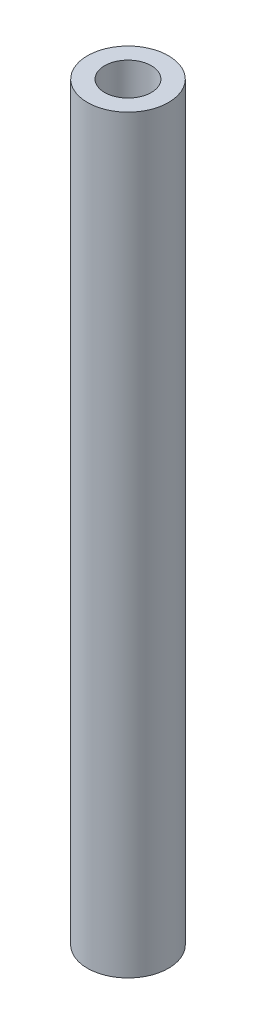
ISO-10303-21;
HEADER;
FILE_DESCRIPTION(('STEP AP214'),'2;1');
FILE_NAME('part.step','',(''),(''),'','','');
FILE_SCHEMA(('AUTOMOTIVE_DESIGN { 1 0 10303 214 1 1 1 1 }'));
ENDSEC;
DATA;
#1=APPLICATION_CONTEXT('core data for automotive mechanical design processes');
#2=APPLICATION_PROTOCOL_DEFINITION('international standard','automotive_design',2000,#1);
#3=PRODUCT_CONTEXT('',#1,'mechanical');
#4=PRODUCT('Part','Part','',(#3));
#5=PRODUCT_RELATED_PRODUCT_CATEGORY('part','',(#4));
#6=PRODUCT_DEFINITION_FORMATION('','',#4);
#7=PRODUCT_DEFINITION_CONTEXT('part definition',#1,'design');
#8=PRODUCT_DEFINITION('design','',#6,#7);
#9=PRODUCT_DEFINITION_SHAPE('','',#8);
#10=(LENGTH_UNIT() NAMED_UNIT(*) SI_UNIT(.MILLI.,.METRE.));
#11=(NAMED_UNIT(*) PLANE_ANGLE_UNIT() SI_UNIT($,.RADIAN.));
#12=(NAMED_UNIT(*) SI_UNIT($,.STERADIAN.) SOLID_ANGLE_UNIT());
#13=UNCERTAINTY_MEASURE_WITH_UNIT(LENGTH_MEASURE(1.E-05),#10,'distance_accuracy_value','');
#14=(GEOMETRIC_REPRESENTATION_CONTEXT(3) GLOBAL_UNCERTAINTY_ASSIGNED_CONTEXT((#13)) GLOBAL_UNIT_ASSIGNED_CONTEXT((#10,
#11,#12)) REPRESENTATION_CONTEXT('',''));
#15=CARTESIAN_POINT('',(0.,0.,0.));
#16=DIRECTION('',(0.,0.,1.));
#17=DIRECTION('',(1.,0.,0.));
#18=AXIS2_PLACEMENT_3D('',#15,#16,#17);
#19=CARTESIAN_POINT('',(0.,37.,0.));
#20=DIRECTION('',(0.,-1.,0.));
#21=DIRECTION('',(0.,0.,-1.));
#22=AXIS2_PLACEMENT_3D('',#19,#20,#21);
#23=CYLINDRICAL_SURFACE('',#22,2.);
#24=CARTESIAN_POINT('',(0.,37.,0.));
#25=DIRECTION('',(0.,1.,0.));
#26=DIRECTION('',(0.,0.,1.));
#27=AXIS2_PLACEMENT_3D('',#24,#25,#26);
#28=CIRCLE('',#27,2.);
#29=CARTESIAN_POINT('',(0.,37.,2.));
#30=VERTEX_POINT('',#29);
#31=EDGE_CURVE('E12',#30,#30,#28,.T.);
#32=ORIENTED_EDGE('',*,*,#31,.F.);
#33=EDGE_LOOP('',(#32));
#34=FACE_BOUND('',#33,.T.);
#35=CARTESIAN_POINT('',(0.,0.,0.));
#36=DIRECTION('',(0.,1.,0.));
#37=DIRECTION('',(0.,0.,1.));
#38=AXIS2_PLACEMENT_3D('',#35,#36,#37);
#39=CIRCLE('',#38,2.);
#40=CARTESIAN_POINT('',(0.,0.,2.));
#41=VERTEX_POINT('',#40);
#42=EDGE_CURVE('E49',#41,#41,#39,.T.);
#43=ORIENTED_EDGE('',*,*,#42,.T.);
#44=EDGE_LOOP('',(#43));
#45=FACE_BOUND('',#44,.T.);
#46=ADVANCED_FACE('F46',(#34,#45),#23,.T.);
#47=CARTESIAN_POINT('',(0.,37.,0.));
#48=DIRECTION('',(0.,1.,0.));
#49=DIRECTION('',(0.,0.,1.));
#50=AXIS2_PLACEMENT_3D('',#47,#48,#49);
#51=PLANE('',#50);
#52=CARTESIAN_POINT('',(0.,37.,0.));
#53=DIRECTION('',(0.,-1.,0.));
#54=DIRECTION('',(0.,0.,-1.));
#55=AXIS2_PLACEMENT_3D('',#52,#53,#54);
#56=CIRCLE('',#55,1.15);
#57=CARTESIAN_POINT('',(0.,37.,-1.15));
#58=VERTEX_POINT('',#57);
#59=EDGE_CURVE('E56',#58,#58,#56,.T.);
#60=ORIENTED_EDGE('',*,*,#59,.T.);
#61=EDGE_LOOP('',(#60));
#62=FACE_BOUND('',#61,.T.);
#63=ORIENTED_EDGE('',*,*,#31,.T.);
#64=EDGE_LOOP('',(#63));
#65=FACE_BOUND('',#64,.T.);
#66=ADVANCED_FACE('F64',(#62,#65),#51,.T.);
#67=CARTESIAN_POINT('',(0.,0.,0.));
#68=DIRECTION('',(0.,1.,0.));
#69=DIRECTION('',(0.,0.,1.));
#70=AXIS2_PLACEMENT_3D('',#67,#68,#69);
#71=PLANE('',#70);
#72=CARTESIAN_POINT('',(0.,0.,0.));
#73=DIRECTION('',(0.,-1.,0.));
#74=DIRECTION('',(0.,0.,-1.));
#75=AXIS2_PLACEMENT_3D('',#72,#73,#74);
#76=CIRCLE('',#75,1.15);
#77=CARTESIAN_POINT('',(0.,0.,-1.15));
#78=VERTEX_POINT('',#77);
#79=EDGE_CURVE('E58',#78,#78,#76,.T.);
#80=ORIENTED_EDGE('',*,*,#79,.F.);
#81=EDGE_LOOP('',(#80));
#82=FACE_BOUND('',#81,.T.);
#83=ORIENTED_EDGE('',*,*,#42,.F.);
#84=EDGE_LOOP('',(#83));
#85=FACE_BOUND('',#84,.T.);
#86=ADVANCED_FACE('F69',(#82,#85),#71,.F.);
#87=CARTESIAN_POINT('',(0.,37.,0.));
#88=DIRECTION('',(0.,-1.,0.));
#89=DIRECTION('',(0.,0.,-1.));
#90=AXIS2_PLACEMENT_3D('',#87,#88,#89);
#91=CYLINDRICAL_SURFACE('',#90,1.15);
#92=ORIENTED_EDGE('',*,*,#59,.F.);
#93=EDGE_LOOP('',(#92));
#94=FACE_BOUND('',#93,.T.);
#95=ORIENTED_EDGE('',*,*,#79,.T.);
#96=EDGE_LOOP('',(#95));
#97=FACE_BOUND('',#96,.T.);
#98=ADVANCED_FACE('F66',(#94,#97),#91,.F.);
#99=CLOSED_SHELL('',(#46,#66,#86,#98));
#100=MANIFOLD_SOLID_BREP('B2',#99);
#101=ADVANCED_BREP_SHAPE_REPRESENTATION('',(#18,#100),#14);
#102=SHAPE_DEFINITION_REPRESENTATION(#9,#101);
ENDSEC;
END-ISO-10303-21;
